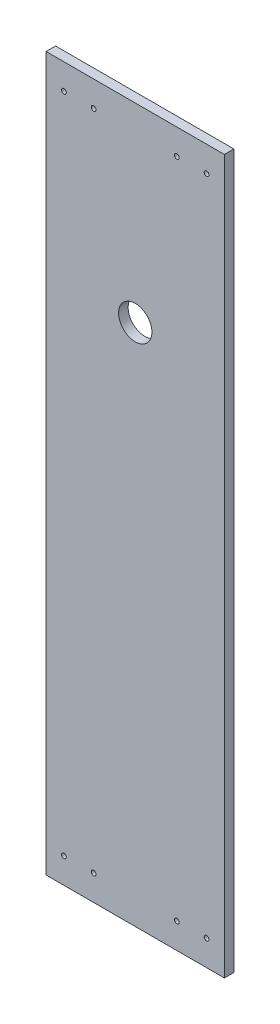
ISO-10303-21;
HEADER;
FILE_DESCRIPTION(('STEP AP214'),'2;1');
FILE_NAME('part.step','',(''),(''),'','','');
FILE_SCHEMA(('AUTOMOTIVE_DESIGN { 1 0 10303 214 1 1 1 1 }'));
ENDSEC;
DATA;
#1=APPLICATION_CONTEXT('core data for automotive mechanical design processes');
#2=APPLICATION_PROTOCOL_DEFINITION('international standard','automotive_design',2000,#1);
#3=PRODUCT_CONTEXT('',#1,'mechanical');
#4=PRODUCT('Part','Part','',(#3));
#5=PRODUCT_RELATED_PRODUCT_CATEGORY('part','',(#4));
#6=PRODUCT_DEFINITION_FORMATION('','',#4);
#7=PRODUCT_DEFINITION_CONTEXT('part definition',#1,'design');
#8=PRODUCT_DEFINITION('design','',#6,#7);
#9=PRODUCT_DEFINITION_SHAPE('','',#8);
#10=(LENGTH_UNIT() NAMED_UNIT(*) SI_UNIT(.MILLI.,.METRE.));
#11=(NAMED_UNIT(*) PLANE_ANGLE_UNIT() SI_UNIT($,.RADIAN.));
#12=(NAMED_UNIT(*) SI_UNIT($,.STERADIAN.) SOLID_ANGLE_UNIT());
#13=UNCERTAINTY_MEASURE_WITH_UNIT(LENGTH_MEASURE(1.E-05),#10,'distance_accuracy_value','');
#14=(GEOMETRIC_REPRESENTATION_CONTEXT(3) GLOBAL_UNCERTAINTY_ASSIGNED_CONTEXT((#13)) GLOBAL_UNIT_ASSIGNED_CONTEXT((#10,
#11,#12)) REPRESENTATION_CONTEXT('',''));
#15=CARTESIAN_POINT('',(0.,0.,0.));
#16=DIRECTION('',(0.,0.,1.));
#17=DIRECTION('',(1.,0.,0.));
#18=AXIS2_PLACEMENT_3D('',#15,#16,#17);
#19=CARTESIAN_POINT('',(75.,600.,-4.));
#20=DIRECTION('',(-1.,0.,0.));
#21=DIRECTION('',(0.,0.,1.));
#22=AXIS2_PLACEMENT_3D('',#19,#20,#21);
#23=PLANE('',#22);
#24=DIRECTION('',(0.,0.,-1.));
#25=VECTOR('',#24,1.);
#26=CARTESIAN_POINT('',(75.,0.,-4.));
#27=LINE('',#26,#25);
#28=CARTESIAN_POINT('',(75.,0.,4.));
#29=VERTEX_POINT('',#28);
#30=CARTESIAN_POINT('',(75.,0.,-4.));
#31=VERTEX_POINT('',#30);
#32=EDGE_CURVE('E100',#29,#31,#27,.T.);
#33=ORIENTED_EDGE('',*,*,#32,.T.);
#34=DIRECTION('',(0.,-1.,0.));
#35=VECTOR('',#34,1.);
#36=CARTESIAN_POINT('',(75.,600.,-4.));
#37=LINE('',#36,#35);
#38=CARTESIAN_POINT('',(75.,600.,-4.));
#39=VERTEX_POINT('',#38);
#40=EDGE_CURVE('E11',#39,#31,#37,.T.);
#41=ORIENTED_EDGE('',*,*,#40,.F.);
#42=DIRECTION('',(0.,0.,-1.));
#43=VECTOR('',#42,1.);
#44=CARTESIAN_POINT('',(75.,600.,-4.));
#45=LINE('',#44,#43);
#46=CARTESIAN_POINT('',(75.,600.,4.));
#47=VERTEX_POINT('',#46);
#48=EDGE_CURVE('E88',#47,#39,#45,.T.);
#49=ORIENTED_EDGE('',*,*,#48,.F.);
#50=DIRECTION('',(0.,-1.,0.));
#51=VECTOR('',#50,1.);
#52=CARTESIAN_POINT('',(75.,600.,4.));
#53=LINE('',#52,#51);
#54=EDGE_CURVE('E96',#47,#29,#53,.T.);
#55=ORIENTED_EDGE('',*,*,#54,.T.);
#56=EDGE_LOOP('',(#33,#41,#49,#55));
#57=FACE_BOUND('',#56,.T.);
#58=ADVANCED_FACE('F37',(#57),#23,.F.);
#59=CARTESIAN_POINT('',(-75.,600.,-4.));
#60=DIRECTION('',(0.,0.,1.));
#61=DIRECTION('',(1.,0.,0.));
#62=AXIS2_PLACEMENT_3D('',#59,#60,#61);
#63=PLANE('',#62);
#64=CARTESIAN_POINT('',(-35.0000000000001,21.499999999984,-3.99999999999643));
#65=DIRECTION('',(0.,0.,-1.));
#66=DIRECTION('',(1.,0.,0.));
#67=AXIS2_PLACEMENT_3D('',#64,#65,#66);
#68=CIRCLE('',#67,2.);
#69=CARTESIAN_POINT('',(-33.0000000000001,21.499999999984,-3.99999999999643));
#70=VERTEX_POINT('',#69);
#71=EDGE_CURVE('E161',#70,#70,#68,.T.);
#72=ORIENTED_EDGE('',*,*,#71,.F.);
#73=EDGE_LOOP('',(#72));
#74=FACE_BOUND('',#73,.T.);
#75=CARTESIAN_POINT('',(-35.0000000000001,578.5,-4.));
#76=DIRECTION('',(0.,0.,1.));
#77=DIRECTION('',(1.,0.,0.));
#78=AXIS2_PLACEMENT_3D('',#75,#76,#77);
#79=CIRCLE('',#78,2.);
#80=CARTESIAN_POINT('',(-33.0000000000001,578.5,-4.));
#81=VERTEX_POINT('',#80);
#82=EDGE_CURVE('E155',#81,#81,#79,.T.);
#83=ORIENTED_EDGE('',*,*,#82,.T.);
#84=EDGE_LOOP('',(#83));
#85=FACE_BOUND('',#84,.T.);
#86=CARTESIAN_POINT('',(-60.0000000000001,21.499999999984,-3.99999999999643));
#87=DIRECTION('',(0.,0.,-1.));
#88=DIRECTION('',(1.,0.,0.));
#89=AXIS2_PLACEMENT_3D('',#86,#87,#88);
#90=CIRCLE('',#89,2.);
#91=CARTESIAN_POINT('',(-58.0000000000001,21.499999999984,-3.99999999999643));
#92=VERTEX_POINT('',#91);
#93=EDGE_CURVE('E149',#92,#92,#90,.T.);
#94=ORIENTED_EDGE('',*,*,#93,.F.);
#95=EDGE_LOOP('',(#94));
#96=FACE_BOUND('',#95,.T.);
#97=CARTESIAN_POINT('',(-60.0000000000001,578.5,-4.));
#98=DIRECTION('',(0.,0.,1.));
#99=DIRECTION('',(1.,0.,0.));
#100=AXIS2_PLACEMENT_3D('',#97,#98,#99);
#101=CIRCLE('',#100,2.);
#102=CARTESIAN_POINT('',(-58.0000000000001,578.5,-4.));
#103=VERTEX_POINT('',#102);
#104=EDGE_CURVE('E141',#103,#103,#101,.T.);
#105=ORIENTED_EDGE('',*,*,#104,.T.);
#106=EDGE_LOOP('',(#105));
#107=FACE_BOUND('',#106,.T.);
#108=CARTESIAN_POINT('',(35.0000000000001,21.499999999984,-3.99999999999643));
#109=DIRECTION('',(0.,0.,1.));
#110=DIRECTION('',(-1.,0.,0.));
#111=AXIS2_PLACEMENT_3D('',#108,#109,#110);
#112=CIRCLE('',#111,2.);
#113=CARTESIAN_POINT('',(33.0000000000001,21.499999999984,-3.99999999999643));
#114=VERTEX_POINT('',#113);
#115=EDGE_CURVE('E138',#114,#114,#112,.T.);
#116=ORIENTED_EDGE('',*,*,#115,.T.);
#117=EDGE_LOOP('',(#116));
#118=FACE_BOUND('',#117,.T.);
#119=CARTESIAN_POINT('',(60.0000000000001,21.499999999984,-3.99999999999643));
#120=DIRECTION('',(0.,0.,1.));
#121=DIRECTION('',(-1.,0.,0.));
#122=AXIS2_PLACEMENT_3D('',#119,#120,#121);
#123=CIRCLE('',#122,2.);
#124=CARTESIAN_POINT('',(58.0000000000001,21.499999999984,-3.99999999999643));
#125=VERTEX_POINT('',#124);
#126=EDGE_CURVE('E132',#125,#125,#123,.T.);
#127=ORIENTED_EDGE('',*,*,#126,.T.);
#128=EDGE_LOOP('',(#127));
#129=FACE_BOUND('',#128,.T.);
#130=CARTESIAN_POINT('',(35.0000000000001,578.5,-4.));
#131=DIRECTION('',(0.,0.,-1.));
#132=DIRECTION('',(-1.,0.,0.));
#133=AXIS2_PLACEMENT_3D('',#130,#131,#132);
#134=CIRCLE('',#133,2.);
#135=CARTESIAN_POINT('',(33.0000000000001,578.5,-4.));
#136=VERTEX_POINT('',#135);
#137=EDGE_CURVE('E126',#136,#136,#134,.T.);
#138=ORIENTED_EDGE('',*,*,#137,.F.);
#139=EDGE_LOOP('',(#138));
#140=FACE_BOUND('',#139,.T.);
#141=CARTESIAN_POINT('',(60.0000000000001,578.5,-4.));
#142=DIRECTION('',(0.,0.,-1.));
#143=DIRECTION('',(-1.,0.,0.));
#144=AXIS2_PLACEMENT_3D('',#141,#142,#143);
#145=CIRCLE('',#144,2.);
#146=CARTESIAN_POINT('',(58.0000000000001,578.5,-4.));
#147=VERTEX_POINT('',#146);
#148=EDGE_CURVE('E120',#147,#147,#145,.T.);
#149=ORIENTED_EDGE('',*,*,#148,.F.);
#150=EDGE_LOOP('',(#149));
#151=FACE_BOUND('',#150,.T.);
#152=CARTESIAN_POINT('',(0.,440.,-4.));
#153=DIRECTION('',(0.,0.,1.));
#154=DIRECTION('',(1.,0.,0.));
#155=AXIS2_PLACEMENT_3D('',#152,#153,#154);
#156=CIRCLE('',#155,14.);
#157=CARTESIAN_POINT('',(14.,440.,-4.));
#158=VERTEX_POINT('',#157);
#159=EDGE_CURVE('E103',#158,#158,#156,.T.);
#160=ORIENTED_EDGE('',*,*,#159,.T.);
#161=EDGE_LOOP('',(#160));
#162=FACE_BOUND('',#161,.T.);
#163=DIRECTION('',(-1.,0.,0.));
#164=VECTOR('',#163,1.);
#165=CARTESIAN_POINT('',(-75.,0.,-4.));
#166=LINE('',#165,#164);
#167=CARTESIAN_POINT('',(-75.,0.,-4.));
#168=VERTEX_POINT('',#167);
#169=EDGE_CURVE('E92',#31,#168,#166,.T.);
#170=ORIENTED_EDGE('',*,*,#169,.T.);
#171=DIRECTION('',(0.,-1.,0.));
#172=VECTOR('',#171,1.);
#173=CARTESIAN_POINT('',(-75.,600.,-4.));
#174=LINE('',#173,#172);
#175=CARTESIAN_POINT('',(-75.,600.,-4.));
#176=VERTEX_POINT('',#175);
#177=EDGE_CURVE('E45',#176,#168,#174,.T.);
#178=ORIENTED_EDGE('',*,*,#177,.F.);
#179=DIRECTION('',(-1.,0.,0.));
#180=VECTOR('',#179,1.);
#181=CARTESIAN_POINT('',(-75.,600.,-4.));
#182=LINE('',#181,#180);
#183=EDGE_CURVE('E83',#39,#176,#182,.T.);
#184=ORIENTED_EDGE('',*,*,#183,.F.);
#185=ORIENTED_EDGE('',*,*,#40,.T.);
#186=EDGE_LOOP('',(#170,#178,#184,#185));
#187=FACE_BOUND('',#186,.T.);
#188=ADVANCED_FACE('F91',(#74,#85,#96,#107,#118,#129,#140,#151,#162,#187),#63,.F.);
#189=CARTESIAN_POINT('',(-75.,600.,-4.));
#190=DIRECTION('',(1.,0.,0.));
#191=DIRECTION('',(0.,0.,-1.));
#192=AXIS2_PLACEMENT_3D('',#189,#190,#191);
#193=PLANE('',#192);
#194=DIRECTION('',(0.,0.,1.));
#195=VECTOR('',#194,1.);
#196=CARTESIAN_POINT('',(-75.,0.,-4.));
#197=LINE('',#196,#195);
#198=CARTESIAN_POINT('',(-75.,0.,4.));
#199=VERTEX_POINT('',#198);
#200=EDGE_CURVE('E70',#168,#199,#197,.T.);
#201=ORIENTED_EDGE('',*,*,#200,.T.);
#202=DIRECTION('',(0.,-1.,0.));
#203=VECTOR('',#202,1.);
#204=CARTESIAN_POINT('',(-75.,600.,4.));
#205=LINE('',#204,#203);
#206=CARTESIAN_POINT('',(-75.,600.,4.));
#207=VERTEX_POINT('',#206);
#208=EDGE_CURVE('E93',#207,#199,#205,.T.);
#209=ORIENTED_EDGE('',*,*,#208,.F.);
#210=DIRECTION('',(0.,0.,1.));
#211=VECTOR('',#210,1.);
#212=CARTESIAN_POINT('',(-75.,600.,-4.));
#213=LINE('',#212,#211);
#214=EDGE_CURVE('E86',#176,#207,#213,.T.);
#215=ORIENTED_EDGE('',*,*,#214,.F.);
#216=ORIENTED_EDGE('',*,*,#177,.T.);
#217=EDGE_LOOP('',(#201,#209,#215,#216));
#218=FACE_BOUND('',#217,.T.);
#219=ADVANCED_FACE('F94',(#218),#193,.F.);
#220=CARTESIAN_POINT('',(-75.,600.,4.));
#221=DIRECTION('',(0.,0.,-1.));
#222=DIRECTION('',(-1.,0.,0.));
#223=AXIS2_PLACEMENT_3D('',#220,#221,#222);
#224=PLANE('',#223);
#225=CARTESIAN_POINT('',(-35.0000000000001,21.499999999984,4.00000000000357));
#226=DIRECTION('',(0.,0.,-1.));
#227=DIRECTION('',(1.,0.,0.));
#228=AXIS2_PLACEMENT_3D('',#225,#226,#227);
#229=CIRCLE('',#228,2.);
#230=CARTESIAN_POINT('',(-33.0000000000001,21.499999999984,4.00000000000357));
#231=VERTEX_POINT('',#230);
#232=EDGE_CURVE('E164',#231,#231,#229,.T.);
#233=ORIENTED_EDGE('',*,*,#232,.T.);
#234=EDGE_LOOP('',(#233));
#235=FACE_BOUND('',#234,.T.);
#236=CARTESIAN_POINT('',(-35.0000000000001,578.5,4.));
#237=DIRECTION('',(0.,0.,1.));
#238=DIRECTION('',(1.,0.,0.));
#239=AXIS2_PLACEMENT_3D('',#236,#237,#238);
#240=CIRCLE('',#239,2.);
#241=CARTESIAN_POINT('',(-33.0000000000001,578.5,4.));
#242=VERTEX_POINT('',#241);
#243=EDGE_CURVE('E158',#242,#242,#240,.T.);
#244=ORIENTED_EDGE('',*,*,#243,.F.);
#245=EDGE_LOOP('',(#244));
#246=FACE_BOUND('',#245,.T.);
#247=CARTESIAN_POINT('',(-60.0000000000001,21.499999999984,4.00000000000357));
#248=DIRECTION('',(0.,0.,-1.));
#249=DIRECTION('',(1.,0.,0.));
#250=AXIS2_PLACEMENT_3D('',#247,#248,#249);
#251=CIRCLE('',#250,2.);
#252=CARTESIAN_POINT('',(-58.0000000000001,21.499999999984,4.00000000000357));
#253=VERTEX_POINT('',#252);
#254=EDGE_CURVE('E152',#253,#253,#251,.T.);
#255=ORIENTED_EDGE('',*,*,#254,.T.);
#256=EDGE_LOOP('',(#255));
#257=FACE_BOUND('',#256,.T.);
#258=CARTESIAN_POINT('',(-60.0000000000001,578.5,4.));
#259=DIRECTION('',(0.,0.,1.));
#260=DIRECTION('',(1.,0.,0.));
#261=AXIS2_PLACEMENT_3D('',#258,#259,#260);
#262=CIRCLE('',#261,2.);
#263=CARTESIAN_POINT('',(-58.0000000000001,578.5,4.));
#264=VERTEX_POINT('',#263);
#265=EDGE_CURVE('E146',#264,#264,#262,.T.);
#266=ORIENTED_EDGE('',*,*,#265,.F.);
#267=EDGE_LOOP('',(#266));
#268=FACE_BOUND('',#267,.T.);
#269=CARTESIAN_POINT('',(35.0000000000001,21.4999999999841,4.00000000000357));
#270=DIRECTION('',(0.,0.,1.));
#271=DIRECTION('',(-1.,0.,0.));
#272=AXIS2_PLACEMENT_3D('',#269,#270,#271);
#273=CIRCLE('',#272,2.);
#274=CARTESIAN_POINT('',(33.0000000000001,21.4999999999841,4.00000000000357));
#275=VERTEX_POINT('',#274);
#276=EDGE_CURVE('E135',#275,#275,#273,.T.);
#277=ORIENTED_EDGE('',*,*,#276,.F.);
#278=EDGE_LOOP('',(#277));
#279=FACE_BOUND('',#278,.T.);
#280=CARTESIAN_POINT('',(60.0000000000001,21.4999999999841,4.00000000000357));
#281=DIRECTION('',(0.,0.,1.));
#282=DIRECTION('',(-1.,0.,0.));
#283=AXIS2_PLACEMENT_3D('',#280,#281,#282);
#284=CIRCLE('',#283,2.);
#285=CARTESIAN_POINT('',(58.0000000000001,21.4999999999841,4.00000000000357));
#286=VERTEX_POINT('',#285);
#287=EDGE_CURVE('E129',#286,#286,#284,.T.);
#288=ORIENTED_EDGE('',*,*,#287,.F.);
#289=EDGE_LOOP('',(#288));
#290=FACE_BOUND('',#289,.T.);
#291=CARTESIAN_POINT('',(35.0000000000001,578.5,4.));
#292=DIRECTION('',(0.,0.,-1.));
#293=DIRECTION('',(-1.,0.,0.));
#294=AXIS2_PLACEMENT_3D('',#291,#292,#293);
#295=CIRCLE('',#294,2.);
#296=CARTESIAN_POINT('',(33.0000000000001,578.5,4.));
#297=VERTEX_POINT('',#296);
#298=EDGE_CURVE('E123',#297,#297,#295,.T.);
#299=ORIENTED_EDGE('',*,*,#298,.T.);
#300=EDGE_LOOP('',(#299));
#301=FACE_BOUND('',#300,.T.);
#302=CARTESIAN_POINT('',(60.0000000000001,578.5,4.));
#303=DIRECTION('',(0.,0.,-1.));
#304=DIRECTION('',(-1.,0.,0.));
#305=AXIS2_PLACEMENT_3D('',#302,#303,#304);
#306=CIRCLE('',#305,2.);
#307=CARTESIAN_POINT('',(58.0000000000001,578.5,4.));
#308=VERTEX_POINT('',#307);
#309=EDGE_CURVE('E119',#308,#308,#306,.T.);
#310=ORIENTED_EDGE('',*,*,#309,.T.);
#311=EDGE_LOOP('',(#310));
#312=FACE_BOUND('',#311,.T.);
#313=CARTESIAN_POINT('',(0.,440.,4.));
#314=DIRECTION('',(0.,0.,1.));
#315=DIRECTION('',(1.,0.,0.));
#316=AXIS2_PLACEMENT_3D('',#313,#314,#315);
#317=CIRCLE('',#316,14.);
#318=CARTESIAN_POINT('',(14.,440.,4.));
#319=VERTEX_POINT('',#318);
#320=EDGE_CURVE('E116',#319,#319,#317,.T.);
#321=ORIENTED_EDGE('',*,*,#320,.F.);
#322=EDGE_LOOP('',(#321));
#323=FACE_BOUND('',#322,.T.);
#324=DIRECTION('',(1.,0.,0.));
#325=VECTOR('',#324,1.);
#326=CARTESIAN_POINT('',(-75.,0.,4.));
#327=LINE('',#326,#325);
#328=EDGE_CURVE('E76',#199,#29,#327,.T.);
#329=ORIENTED_EDGE('',*,*,#328,.T.);
#330=ORIENTED_EDGE('',*,*,#54,.F.);
#331=DIRECTION('',(1.,0.,0.));
#332=VECTOR('',#331,1.);
#333=CARTESIAN_POINT('',(-75.,600.,4.));
#334=LINE('',#333,#332);
#335=EDGE_CURVE('E53',#207,#47,#334,.T.);
#336=ORIENTED_EDGE('',*,*,#335,.F.);
#337=ORIENTED_EDGE('',*,*,#208,.T.);
#338=EDGE_LOOP('',(#329,#330,#336,#337));
#339=FACE_BOUND('',#338,.T.);
#340=ADVANCED_FACE('F108',(#235,#246,#257,#268,#279,#290,#301,#312,#323,#339),#224,.F.);
#341=CARTESIAN_POINT('',(0.,600.,0.));
#342=DIRECTION('',(0.,1.,0.));
#343=DIRECTION('',(0.,0.,1.));
#344=AXIS2_PLACEMENT_3D('',#341,#342,#343);
#345=PLANE('',#344);
#346=ORIENTED_EDGE('',*,*,#48,.T.);
#347=ORIENTED_EDGE('',*,*,#183,.T.);
#348=ORIENTED_EDGE('',*,*,#214,.T.);
#349=ORIENTED_EDGE('',*,*,#335,.T.);
#350=EDGE_LOOP('',(#346,#347,#348,#349));
#351=FACE_BOUND('',#350,.T.);
#352=ADVANCED_FACE('F84',(#351),#345,.T.);
#353=CARTESIAN_POINT('',(0.,0.,0.));
#354=DIRECTION('',(0.,1.,0.));
#355=DIRECTION('',(0.,0.,1.));
#356=AXIS2_PLACEMENT_3D('',#353,#354,#355);
#357=PLANE('',#356);
#358=ORIENTED_EDGE('',*,*,#32,.F.);
#359=ORIENTED_EDGE('',*,*,#328,.F.);
#360=ORIENTED_EDGE('',*,*,#200,.F.);
#361=ORIENTED_EDGE('',*,*,#169,.F.);
#362=EDGE_LOOP('',(#358,#359,#360,#361));
#363=FACE_BOUND('',#362,.T.);
#364=ADVANCED_FACE('F111',(#363),#357,.F.);
#365=CARTESIAN_POINT('',(0.,440.,-596.));
#366=DIRECTION('',(0.,0.,1.));
#367=DIRECTION('',(1.,0.,0.));
#368=AXIS2_PLACEMENT_3D('',#365,#366,#367);
#369=CYLINDRICAL_SURFACE('',#368,14.);
#370=ORIENTED_EDGE('',*,*,#320,.T.);
#371=EDGE_LOOP('',(#370));
#372=FACE_BOUND('',#371,.T.);
#373=ORIENTED_EDGE('',*,*,#159,.F.);
#374=EDGE_LOOP('',(#373));
#375=FACE_BOUND('',#374,.T.);
#376=ADVANCED_FACE('F195',(#372,#375),#369,.F.);
#377=CARTESIAN_POINT('',(60.0000000000001,578.5,4.));
#378=DIRECTION('',(0.,0.,-1.));
#379=DIRECTION('',(-1.,0.,0.));
#380=AXIS2_PLACEMENT_3D('',#377,#378,#379);
#381=CYLINDRICAL_SURFACE('',#380,2.);
#382=ORIENTED_EDGE('',*,*,#309,.F.);
#383=EDGE_LOOP('',(#382));
#384=FACE_BOUND('',#383,.T.);
#385=ORIENTED_EDGE('',*,*,#148,.T.);
#386=EDGE_LOOP('',(#385));
#387=FACE_BOUND('',#386,.T.);
#388=ADVANCED_FACE('F197',(#384,#387),#381,.F.);
#389=CARTESIAN_POINT('',(35.0000000000001,578.5,4.));
#390=DIRECTION('',(0.,0.,-1.));
#391=DIRECTION('',(-1.,0.,0.));
#392=AXIS2_PLACEMENT_3D('',#389,#390,#391);
#393=CYLINDRICAL_SURFACE('',#392,2.);
#394=ORIENTED_EDGE('',*,*,#298,.F.);
#395=EDGE_LOOP('',(#394));
#396=FACE_BOUND('',#395,.T.);
#397=ORIENTED_EDGE('',*,*,#137,.T.);
#398=EDGE_LOOP('',(#397));
#399=FACE_BOUND('',#398,.T.);
#400=ADVANCED_FACE('F204',(#396,#399),#393,.F.);
#401=CARTESIAN_POINT('',(60.0000000000001,21.4999999999841,4.00000000000357));
#402=DIRECTION('',(0.,0.,-1.));
#403=DIRECTION('',(0.,1.,0.));
#404=AXIS2_PLACEMENT_3D('',#401,#402,#403);
#405=CYLINDRICAL_SURFACE('',#404,2.);
#406=ORIENTED_EDGE('',*,*,#287,.T.);
#407=EDGE_LOOP('',(#406));
#408=FACE_BOUND('',#407,.T.);
#409=ORIENTED_EDGE('',*,*,#126,.F.);
#410=EDGE_LOOP('',(#409));
#411=FACE_BOUND('',#410,.T.);
#412=ADVANCED_FACE('F258',(#408,#411),#405,.F.);
#413=CARTESIAN_POINT('',(35.0000000000001,21.4999999999841,4.00000000000357));
#414=DIRECTION('',(0.,0.,-1.));
#415=DIRECTION('',(0.,1.,0.));
#416=AXIS2_PLACEMENT_3D('',#413,#414,#415);
#417=CYLINDRICAL_SURFACE('',#416,2.);
#418=ORIENTED_EDGE('',*,*,#276,.T.);
#419=EDGE_LOOP('',(#418));
#420=FACE_BOUND('',#419,.T.);
#421=ORIENTED_EDGE('',*,*,#115,.F.);
#422=EDGE_LOOP('',(#421));
#423=FACE_BOUND('',#422,.T.);
#424=ADVANCED_FACE('F267',(#420,#423),#417,.F.);
#425=CARTESIAN_POINT('',(-60.0000000000001,578.5,4.));
#426=DIRECTION('',(0.,0.,-1.));
#427=DIRECTION('',(1.,0.,0.));
#428=AXIS2_PLACEMENT_3D('',#425,#426,#427);
#429=CYLINDRICAL_SURFACE('',#428,2.);
#430=ORIENTED_EDGE('',*,*,#265,.T.);
#431=EDGE_LOOP('',(#430));
#432=FACE_BOUND('',#431,.T.);
#433=ORIENTED_EDGE('',*,*,#104,.F.);
#434=EDGE_LOOP('',(#433));
#435=FACE_BOUND('',#434,.T.);
#436=ADVANCED_FACE('F276',(#432,#435),#429,.F.);
#437=CARTESIAN_POINT('',(-60.0000000000001,21.499999999984,4.00000000000357));
#438=DIRECTION('',(0.,0.,-1.));
#439=DIRECTION('',(1.,0.,0.));
#440=AXIS2_PLACEMENT_3D('',#437,#438,#439);
#441=CYLINDRICAL_SURFACE('',#440,2.);
#442=ORIENTED_EDGE('',*,*,#254,.F.);
#443=EDGE_LOOP('',(#442));
#444=FACE_BOUND('',#443,.T.);
#445=ORIENTED_EDGE('',*,*,#93,.T.);
#446=EDGE_LOOP('',(#445));
#447=FACE_BOUND('',#446,.T.);
#448=ADVANCED_FACE('F286',(#444,#447),#441,.F.);
#449=CARTESIAN_POINT('',(-35.0000000000001,578.5,4.));
#450=DIRECTION('',(0.,0.,-1.));
#451=DIRECTION('',(1.,0.,0.));
#452=AXIS2_PLACEMENT_3D('',#449,#450,#451);
#453=CYLINDRICAL_SURFACE('',#452,2.);
#454=ORIENTED_EDGE('',*,*,#243,.T.);
#455=EDGE_LOOP('',(#454));
#456=FACE_BOUND('',#455,.T.);
#457=ORIENTED_EDGE('',*,*,#82,.F.);
#458=EDGE_LOOP('',(#457));
#459=FACE_BOUND('',#458,.T.);
#460=ADVANCED_FACE('F173',(#456,#459),#453,.F.);
#461=CARTESIAN_POINT('',(-35.0000000000001,21.499999999984,4.00000000000357));
#462=DIRECTION('',(0.,0.,-1.));
#463=DIRECTION('',(1.,0.,0.));
#464=AXIS2_PLACEMENT_3D('',#461,#462,#463);
#465=CYLINDRICAL_SURFACE('',#464,2.);
#466=ORIENTED_EDGE('',*,*,#232,.F.);
#467=EDGE_LOOP('',(#466));
#468=FACE_BOUND('',#467,.T.);
#469=ORIENTED_EDGE('',*,*,#71,.T.);
#470=EDGE_LOOP('',(#469));
#471=FACE_BOUND('',#470,.T.);
#472=ADVANCED_FACE('F170',(#468,#471),#465,.F.);
#473=CLOSED_SHELL('',(#58,#188,#219,#340,#352,#364,#376,#388,#400,#412,#424,#436,#448,#460,#472));
#474=MANIFOLD_SOLID_BREP('B2',#473);
#475=ADVANCED_BREP_SHAPE_REPRESENTATION('',(#18,#474),#14);
#476=SHAPE_DEFINITION_REPRESENTATION(#9,#475);
ENDSEC;
END-ISO-10303-21;
